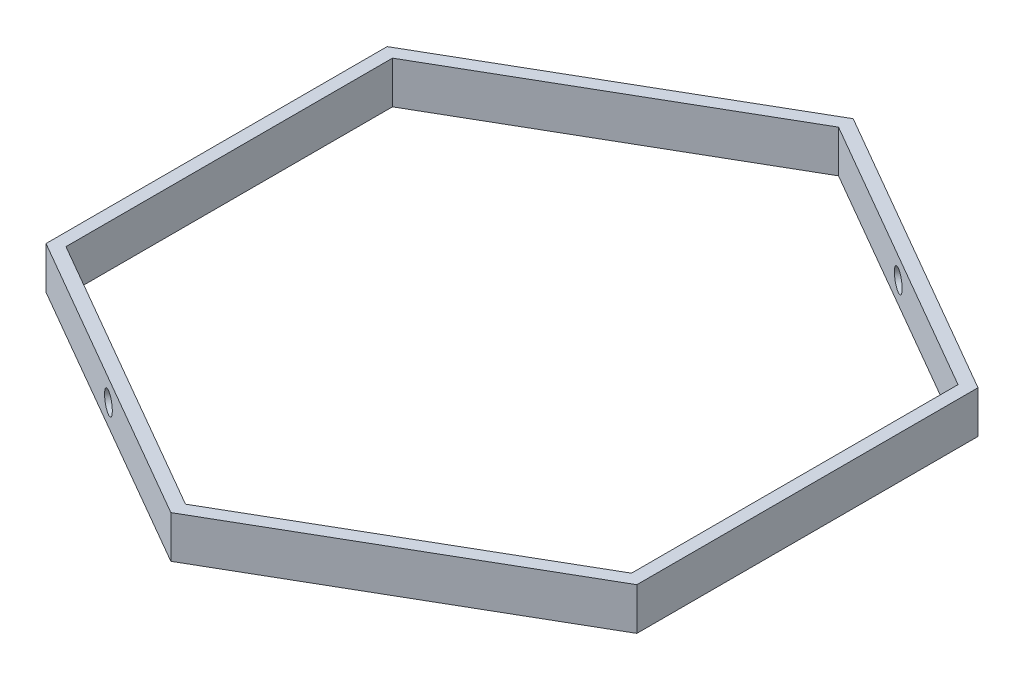
ISO-10303-21;
HEADER;
FILE_DESCRIPTION(('STEP AP214'),'2;1');
FILE_NAME('part.step','',(''),(''),'','','');
FILE_SCHEMA(('AUTOMOTIVE_DESIGN { 1 0 10303 214 1 1 1 1 }'));
ENDSEC;
DATA;
#1=APPLICATION_CONTEXT('core data for automotive mechanical design processes');
#2=APPLICATION_PROTOCOL_DEFINITION('international standard','automotive_design',2000,#1);
#3=PRODUCT_CONTEXT('',#1,'mechanical');
#4=PRODUCT('Part','Part','',(#3));
#5=PRODUCT_RELATED_PRODUCT_CATEGORY('part','',(#4));
#6=PRODUCT_DEFINITION_FORMATION('','',#4);
#7=PRODUCT_DEFINITION_CONTEXT('part definition',#1,'design');
#8=PRODUCT_DEFINITION('design','',#6,#7);
#9=PRODUCT_DEFINITION_SHAPE('','',#8);
#10=(LENGTH_UNIT() NAMED_UNIT(*) SI_UNIT(.MILLI.,.METRE.));
#11=(NAMED_UNIT(*) PLANE_ANGLE_UNIT() SI_UNIT($,.RADIAN.));
#12=(NAMED_UNIT(*) SI_UNIT($,.STERADIAN.) SOLID_ANGLE_UNIT());
#13=UNCERTAINTY_MEASURE_WITH_UNIT(LENGTH_MEASURE(1.E-05),#10,'distance_accuracy_value','');
#14=(GEOMETRIC_REPRESENTATION_CONTEXT(3) GLOBAL_UNCERTAINTY_ASSIGNED_CONTEXT((#13)) GLOBAL_UNIT_ASSIGNED_CONTEXT((#10,
#11,#12)) REPRESENTATION_CONTEXT('',''));
#15=CARTESIAN_POINT('',(0.,0.,0.));
#16=DIRECTION('',(0.,0.,1.));
#17=DIRECTION('',(1.,0.,0.));
#18=AXIS2_PLACEMENT_3D('',#15,#16,#17);
#19=CARTESIAN_POINT('',(0.,4.,0.));
#20=DIRECTION('',(0.,1.,0.));
#21=DIRECTION('',(0.,0.,1.));
#22=AXIS2_PLACEMENT_3D('',#19,#20,#21);
#23=PLANE('',#22);
#24=DIRECTION('',(-0.866025403784439,0.,-0.5));
#25=VECTOR('',#24,1.);
#26=CARTESIAN_POINT('',(28.,4.,-16.1658075373095));
#27=LINE('',#26,#25);
#28=CARTESIAN_POINT('',(28.,4.,-16.1658075373095));
#29=VERTEX_POINT('',#28);
#30=CARTESIAN_POINT('',(0.,4.,-32.331615074619));
#31=VERTEX_POINT('',#30);
#32=EDGE_CURVE('E182',#29,#31,#27,.T.);
#33=ORIENTED_EDGE('',*,*,#32,.T.);
#34=DIRECTION('',(-0.866025403784439,0.,0.5));
#35=VECTOR('',#34,1.);
#36=CARTESIAN_POINT('',(0.,4.,-32.331615074619));
#37=LINE('',#36,#35);
#38=CARTESIAN_POINT('',(-28.,4.,-16.1658075373095));
#39=VERTEX_POINT('',#38);
#40=EDGE_CURVE('E185',#31,#39,#37,.T.);
#41=ORIENTED_EDGE('',*,*,#40,.T.);
#42=DIRECTION('',(0.,0.,1.));
#43=VECTOR('',#42,1.);
#44=CARTESIAN_POINT('',(-28.,4.,-16.1658075373095));
#45=LINE('',#44,#43);
#46=CARTESIAN_POINT('',(-28.,4.,16.1658075373095));
#47=VERTEX_POINT('',#46);
#48=EDGE_CURVE('E188',#39,#47,#45,.T.);
#49=ORIENTED_EDGE('',*,*,#48,.T.);
#50=DIRECTION('',(0.866025403784439,0.,0.5));
#51=VECTOR('',#50,1.);
#52=CARTESIAN_POINT('',(-28.,4.,16.1658075373095));
#53=LINE('',#52,#51);
#54=CARTESIAN_POINT('',(0.,4.,32.3316150746191));
#55=VERTEX_POINT('',#54);
#56=EDGE_CURVE('E190',#47,#55,#53,.T.);
#57=ORIENTED_EDGE('',*,*,#56,.T.);
#58=DIRECTION('',(0.866025403784439,0.,-0.5));
#59=VECTOR('',#58,1.);
#60=CARTESIAN_POINT('',(0.,4.,32.3316150746191));
#61=LINE('',#60,#59);
#62=CARTESIAN_POINT('',(28.,4.,16.1658075373095));
#63=VERTEX_POINT('',#62);
#64=EDGE_CURVE('E192',#55,#63,#61,.T.);
#65=ORIENTED_EDGE('',*,*,#64,.T.);
#66=DIRECTION('',(0.,0.,-1.));
#67=VECTOR('',#66,1.);
#68=CARTESIAN_POINT('',(28.,4.,16.1658075373095));
#69=LINE('',#68,#67);
#70=EDGE_CURVE('E194',#63,#29,#69,.T.);
#71=ORIENTED_EDGE('',*,*,#70,.T.);
#72=EDGE_LOOP('',(#33,#41,#49,#57,#65,#71));
#73=FACE_BOUND('',#72,.T.);
#74=DIRECTION('',(-0.866025403784439,0.,-0.5));
#75=VECTOR('',#74,1.);
#76=CARTESIAN_POINT('',(26.8,4.,-15.472987214282));
#77=LINE('',#76,#75);
#78=CARTESIAN_POINT('',(26.8,4.,-15.472987214282));
#79=VERTEX_POINT('',#78);
#80=CARTESIAN_POINT('',(0.,4.,-30.9459744285639));
#81=VERTEX_POINT('',#80);
#82=EDGE_CURVE('E137',#79,#81,#77,.T.);
#83=ORIENTED_EDGE('',*,*,#82,.F.);
#84=DIRECTION('',(0.,0.,-1.));
#85=VECTOR('',#84,1.);
#86=CARTESIAN_POINT('',(26.8,4.,15.472987214282));
#87=LINE('',#86,#85);
#88=CARTESIAN_POINT('',(26.8,4.,15.472987214282));
#89=VERTEX_POINT('',#88);
#90=EDGE_CURVE('E129',#89,#79,#87,.T.);
#91=ORIENTED_EDGE('',*,*,#90,.F.);
#92=DIRECTION('',(0.866025403784438,0.,-0.5));
#93=VECTOR('',#92,1.);
#94=CARTESIAN_POINT('',(0.,4.,30.945974428564));
#95=LINE('',#94,#93);
#96=CARTESIAN_POINT('',(0.,4.,30.945974428564));
#97=VERTEX_POINT('',#96);
#98=EDGE_CURVE('E159',#97,#89,#95,.T.);
#99=ORIENTED_EDGE('',*,*,#98,.F.);
#100=DIRECTION('',(0.866025403784439,0.,0.5));
#101=VECTOR('',#100,1.);
#102=CARTESIAN_POINT('',(-26.8,4.,15.472987214282));
#103=LINE('',#102,#101);
#104=CARTESIAN_POINT('',(-26.8,4.,15.472987214282));
#105=VERTEX_POINT('',#104);
#106=EDGE_CURVE('E157',#105,#97,#103,.T.);
#107=ORIENTED_EDGE('',*,*,#106,.F.);
#108=DIRECTION('',(0.,0.,1.));
#109=VECTOR('',#108,1.);
#110=CARTESIAN_POINT('',(-26.8,4.,-15.472987214282));
#111=LINE('',#110,#109);
#112=CARTESIAN_POINT('',(-26.8,4.,-15.472987214282));
#113=VERTEX_POINT('',#112);
#114=EDGE_CURVE('E152',#113,#105,#111,.T.);
#115=ORIENTED_EDGE('',*,*,#114,.F.);
#116=DIRECTION('',(-0.866025403784439,0.,0.5));
#117=VECTOR('',#116,1.);
#118=CARTESIAN_POINT('',(0.,4.,-30.9459744285639));
#119=LINE('',#118,#117);
#120=EDGE_CURVE('E150',#81,#113,#119,.T.);
#121=ORIENTED_EDGE('',*,*,#120,.F.);
#122=EDGE_LOOP('',(#83,#91,#99,#107,#115,#121));
#123=FACE_BOUND('',#122,.T.);
#124=ADVANCED_FACE('F39',(#73,#123),#23,.T.);
#125=CARTESIAN_POINT('',(0.,0.,0.));
#126=DIRECTION('',(0.,1.,0.));
#127=DIRECTION('',(0.,0.,1.));
#128=AXIS2_PLACEMENT_3D('',#125,#126,#127);
#129=PLANE('',#128);
#130=DIRECTION('',(-0.866025403784439,0.,-0.5));
#131=VECTOR('',#130,1.);
#132=CARTESIAN_POINT('',(28.,0.,-16.1658075373095));
#133=LINE('',#132,#131);
#134=CARTESIAN_POINT('',(28.,0.,-16.1658075373095));
#135=VERTEX_POINT('',#134);
#136=CARTESIAN_POINT('',(0.,0.,-32.331615074619));
#137=VERTEX_POINT('',#136);
#138=EDGE_CURVE('E145',#135,#137,#133,.T.);
#139=ORIENTED_EDGE('',*,*,#138,.F.);
#140=DIRECTION('',(0.,0.,-1.));
#141=VECTOR('',#140,1.);
#142=CARTESIAN_POINT('',(28.,0.,16.1658075373095));
#143=LINE('',#142,#141);
#144=CARTESIAN_POINT('',(28.,0.,16.1658075373095));
#145=VERTEX_POINT('',#144);
#146=EDGE_CURVE('E186',#145,#135,#143,.T.);
#147=ORIENTED_EDGE('',*,*,#146,.F.);
#148=DIRECTION('',(0.866025403784439,0.,-0.5));
#149=VECTOR('',#148,1.);
#150=CARTESIAN_POINT('',(0.,0.,32.3316150746191));
#151=LINE('',#150,#149);
#152=CARTESIAN_POINT('',(0.,0.,32.3316150746191));
#153=VERTEX_POINT('',#152);
#154=EDGE_CURVE('E205',#153,#145,#151,.T.);
#155=ORIENTED_EDGE('',*,*,#154,.F.);
#156=DIRECTION('',(0.866025403784439,0.,0.5));
#157=VECTOR('',#156,1.);
#158=CARTESIAN_POINT('',(-28.,0.,16.1658075373095));
#159=LINE('',#158,#157);
#160=CARTESIAN_POINT('',(-28.,0.,16.1658075373095));
#161=VERTEX_POINT('',#160);
#162=EDGE_CURVE('E203',#161,#153,#159,.T.);
#163=ORIENTED_EDGE('',*,*,#162,.F.);
#164=DIRECTION('',(0.,0.,1.));
#165=VECTOR('',#164,1.);
#166=CARTESIAN_POINT('',(-28.,0.,-16.1658075373095));
#167=LINE('',#166,#165);
#168=CARTESIAN_POINT('',(-28.,0.,-16.1658075373095));
#169=VERTEX_POINT('',#168);
#170=EDGE_CURVE('E201',#169,#161,#167,.T.);
#171=ORIENTED_EDGE('',*,*,#170,.F.);
#172=DIRECTION('',(-0.866025403784439,0.,0.5));
#173=VECTOR('',#172,1.);
#174=CARTESIAN_POINT('',(0.,0.,-32.331615074619));
#175=LINE('',#174,#173);
#176=EDGE_CURVE('E199',#137,#169,#175,.T.);
#177=ORIENTED_EDGE('',*,*,#176,.F.);
#178=EDGE_LOOP('',(#139,#147,#155,#163,#171,#177));
#179=FACE_BOUND('',#178,.T.);
#180=DIRECTION('',(0.,0.,-1.));
#181=VECTOR('',#180,1.);
#182=CARTESIAN_POINT('',(26.8,0.,15.472987214282));
#183=LINE('',#182,#181);
#184=CARTESIAN_POINT('',(26.8,0.,15.472987214282));
#185=VERTEX_POINT('',#184);
#186=CARTESIAN_POINT('',(26.8,0.,-15.472987214282));
#187=VERTEX_POINT('',#186);
#188=EDGE_CURVE('E63',#185,#187,#183,.T.);
#189=ORIENTED_EDGE('',*,*,#188,.T.);
#190=DIRECTION('',(-0.866025403784439,0.,-0.5));
#191=VECTOR('',#190,1.);
#192=CARTESIAN_POINT('',(26.8,0.,-15.472987214282));
#193=LINE('',#192,#191);
#194=CARTESIAN_POINT('',(0.,0.,-30.9459744285639));
#195=VERTEX_POINT('',#194);
#196=EDGE_CURVE('E144',#187,#195,#193,.T.);
#197=ORIENTED_EDGE('',*,*,#196,.T.);
#198=DIRECTION('',(-0.866025403784439,0.,0.5));
#199=VECTOR('',#198,1.);
#200=CARTESIAN_POINT('',(0.,0.,-30.9459744285639));
#201=LINE('',#200,#199);
#202=CARTESIAN_POINT('',(-26.8,0.,-15.472987214282));
#203=VERTEX_POINT('',#202);
#204=EDGE_CURVE('E164',#195,#203,#201,.T.);
#205=ORIENTED_EDGE('',*,*,#204,.T.);
#206=DIRECTION('',(0.,0.,1.));
#207=VECTOR('',#206,1.);
#208=CARTESIAN_POINT('',(-26.8,0.,-15.472987214282));
#209=LINE('',#208,#207);
#210=CARTESIAN_POINT('',(-26.8,0.,15.472987214282));
#211=VERTEX_POINT('',#210);
#212=EDGE_CURVE('E167',#203,#211,#209,.T.);
#213=ORIENTED_EDGE('',*,*,#212,.T.);
#214=DIRECTION('',(0.866025403784439,0.,0.5));
#215=VECTOR('',#214,1.);
#216=CARTESIAN_POINT('',(-26.8,0.,15.472987214282));
#217=LINE('',#216,#215);
#218=CARTESIAN_POINT('',(0.,0.,30.945974428564));
#219=VERTEX_POINT('',#218);
#220=EDGE_CURVE('E170',#211,#219,#217,.T.);
#221=ORIENTED_EDGE('',*,*,#220,.T.);
#222=DIRECTION('',(0.866025403784438,0.,-0.5));
#223=VECTOR('',#222,1.);
#224=CARTESIAN_POINT('',(0.,0.,30.945974428564));
#225=LINE('',#224,#223);
#226=EDGE_CURVE('E138',#219,#185,#225,.T.);
#227=ORIENTED_EDGE('',*,*,#226,.T.);
#228=EDGE_LOOP('',(#189,#197,#205,#213,#221,#227));
#229=FACE_BOUND('',#228,.T.);
#230=ADVANCED_FACE('F230',(#179,#229),#129,.F.);
#231=CARTESIAN_POINT('',(28.,4.,-16.1658075373095));
#232=DIRECTION('',(-0.5,0.,0.866025403784439));
#233=DIRECTION('',(0.866025403784439,0.,0.5));
#234=AXIS2_PLACEMENT_3D('',#231,#232,#233);
#235=PLANE('',#234);
#236=CARTESIAN_POINT('',(14.,2.,-24.2487113059643));
#237=DIRECTION('',(-0.5,0.,0.866025403784439));
#238=DIRECTION('',(0.866025403784439,0.,0.5));
#239=AXIS2_PLACEMENT_3D('',#236,#237,#238);
#240=CIRCLE('',#239,1.);
#241=CARTESIAN_POINT('',(14.8660254037845,2.,-23.7487113059643));
#242=VERTEX_POINT('',#241);
#243=EDGE_CURVE('E162',#242,#242,#240,.T.);
#244=ORIENTED_EDGE('',*,*,#243,.T.);
#245=EDGE_LOOP('',(#244));
#246=FACE_BOUND('',#245,.T.);
#247=ORIENTED_EDGE('',*,*,#138,.T.);
#248=DIRECTION('',(0.,-1.,0.));
#249=VECTOR('',#248,1.);
#250=CARTESIAN_POINT('',(0.,4.,-32.331615074619));
#251=LINE('',#250,#249);
#252=EDGE_CURVE('E11',#31,#137,#251,.T.);
#253=ORIENTED_EDGE('',*,*,#252,.F.);
#254=ORIENTED_EDGE('',*,*,#32,.F.);
#255=DIRECTION('',(0.,-1.,0.));
#256=VECTOR('',#255,1.);
#257=CARTESIAN_POINT('',(28.,4.,-16.1658075373095));
#258=LINE('',#257,#256);
#259=EDGE_CURVE('E196',#29,#135,#258,.T.);
#260=ORIENTED_EDGE('',*,*,#259,.T.);
#261=EDGE_LOOP('',(#247,#253,#254,#260));
#262=FACE_BOUND('',#261,.T.);
#263=ADVANCED_FACE('F41',(#246,#262),#235,.F.);
#264=CARTESIAN_POINT('',(0.,4.,-32.331615074619));
#265=DIRECTION('',(0.5,0.,0.866025403784439));
#266=DIRECTION('',(0.866025403784439,0.,-0.5));
#267=AXIS2_PLACEMENT_3D('',#264,#265,#266);
#268=PLANE('',#267);
#269=ORIENTED_EDGE('',*,*,#176,.T.);
#270=DIRECTION('',(0.,-1.,0.));
#271=VECTOR('',#270,1.);
#272=CARTESIAN_POINT('',(-28.,4.,-16.1658075373095));
#273=LINE('',#272,#271);
#274=EDGE_CURVE('E48',#39,#169,#273,.T.);
#275=ORIENTED_EDGE('',*,*,#274,.F.);
#276=ORIENTED_EDGE('',*,*,#40,.F.);
#277=ORIENTED_EDGE('',*,*,#252,.T.);
#278=EDGE_LOOP('',(#269,#275,#276,#277));
#279=FACE_BOUND('',#278,.T.);
#280=ADVANCED_FACE('F247',(#279),#268,.F.);
#281=CARTESIAN_POINT('',(-28.,4.,-16.1658075373095));
#282=DIRECTION('',(1.,0.,0.));
#283=DIRECTION('',(0.,0.,-1.));
#284=AXIS2_PLACEMENT_3D('',#281,#282,#283);
#285=PLANE('',#284);
#286=ORIENTED_EDGE('',*,*,#170,.T.);
#287=DIRECTION('',(0.,-1.,0.));
#288=VECTOR('',#287,1.);
#289=CARTESIAN_POINT('',(-28.,4.,16.1658075373095));
#290=LINE('',#289,#288);
#291=EDGE_CURVE('E216',#47,#161,#290,.T.);
#292=ORIENTED_EDGE('',*,*,#291,.F.);
#293=ORIENTED_EDGE('',*,*,#48,.F.);
#294=ORIENTED_EDGE('',*,*,#274,.T.);
#295=EDGE_LOOP('',(#286,#292,#293,#294));
#296=FACE_BOUND('',#295,.T.);
#297=ADVANCED_FACE('F224',(#296),#285,.F.);
#298=CARTESIAN_POINT('',(-28.,4.,16.1658075373095));
#299=DIRECTION('',(0.5,0.,-0.866025403784439));
#300=DIRECTION('',(-0.866025403784439,0.,-0.5));
#301=AXIS2_PLACEMENT_3D('',#298,#299,#300);
#302=PLANE('',#301);
#303=CARTESIAN_POINT('',(-14.,2.,24.2487113059643));
#304=DIRECTION('',(-0.5,0.,0.866025403784439));
#305=DIRECTION('',(0.866025403784439,0.,0.5));
#306=AXIS2_PLACEMENT_3D('',#303,#304,#305);
#307=CIRCLE('',#306,1.);
#308=CARTESIAN_POINT('',(-13.1339745962156,2.,24.7487113059643));
#309=VERTEX_POINT('',#308);
#310=EDGE_CURVE('E297',#309,#309,#307,.T.);
#311=ORIENTED_EDGE('',*,*,#310,.F.);
#312=EDGE_LOOP('',(#311));
#313=FACE_BOUND('',#312,.T.);
#314=ORIENTED_EDGE('',*,*,#162,.T.);
#315=DIRECTION('',(0.,-1.,0.));
#316=VECTOR('',#315,1.);
#317=CARTESIAN_POINT('',(0.,4.,32.3316150746191));
#318=LINE('',#317,#316);
#319=EDGE_CURVE('E213',#55,#153,#318,.T.);
#320=ORIENTED_EDGE('',*,*,#319,.F.);
#321=ORIENTED_EDGE('',*,*,#56,.F.);
#322=ORIENTED_EDGE('',*,*,#291,.T.);
#323=EDGE_LOOP('',(#314,#320,#321,#322));
#324=FACE_BOUND('',#323,.T.);
#325=ADVANCED_FACE('F236',(#313,#324),#302,.F.);
#326=CARTESIAN_POINT('',(0.,4.,32.3316150746191));
#327=DIRECTION('',(-0.5,0.,-0.866025403784438));
#328=DIRECTION('',(-0.866025403784439,0.,0.5));
#329=AXIS2_PLACEMENT_3D('',#326,#327,#328);
#330=PLANE('',#329);
#331=ORIENTED_EDGE('',*,*,#154,.T.);
#332=DIRECTION('',(0.,-1.,0.));
#333=VECTOR('',#332,1.);
#334=CARTESIAN_POINT('',(28.,4.,16.1658075373095));
#335=LINE('',#334,#333);
#336=EDGE_CURVE('E210',#63,#145,#335,.T.);
#337=ORIENTED_EDGE('',*,*,#336,.F.);
#338=ORIENTED_EDGE('',*,*,#64,.F.);
#339=ORIENTED_EDGE('',*,*,#319,.T.);
#340=EDGE_LOOP('',(#331,#337,#338,#339));
#341=FACE_BOUND('',#340,.T.);
#342=ADVANCED_FACE('F240',(#341),#330,.F.);
#343=CARTESIAN_POINT('',(28.,4.,16.1658075373095));
#344=DIRECTION('',(-1.,0.,0.));
#345=DIRECTION('',(0.,0.,1.));
#346=AXIS2_PLACEMENT_3D('',#343,#344,#345);
#347=PLANE('',#346);
#348=ORIENTED_EDGE('',*,*,#146,.T.);
#349=ORIENTED_EDGE('',*,*,#259,.F.);
#350=ORIENTED_EDGE('',*,*,#70,.F.);
#351=ORIENTED_EDGE('',*,*,#336,.T.);
#352=EDGE_LOOP('',(#348,#349,#350,#351));
#353=FACE_BOUND('',#352,.T.);
#354=ADVANCED_FACE('F250',(#353),#347,.F.);
#355=CARTESIAN_POINT('',(26.8,4.,15.472987214282));
#356=DIRECTION('',(-1.,0.,0.));
#357=DIRECTION('',(0.,0.,1.));
#358=AXIS2_PLACEMENT_3D('',#355,#356,#357);
#359=PLANE('',#358);
#360=ORIENTED_EDGE('',*,*,#188,.F.);
#361=DIRECTION('',(0.,-1.,0.));
#362=VECTOR('',#361,1.);
#363=CARTESIAN_POINT('',(26.8,4.,15.472987214282));
#364=LINE('',#363,#362);
#365=EDGE_CURVE('E133',#89,#185,#364,.T.);
#366=ORIENTED_EDGE('',*,*,#365,.F.);
#367=ORIENTED_EDGE('',*,*,#90,.T.);
#368=DIRECTION('',(0.,-1.,0.));
#369=VECTOR('',#368,1.);
#370=CARTESIAN_POINT('',(26.8,4.,-15.472987214282));
#371=LINE('',#370,#369);
#372=EDGE_CURVE('E132',#79,#187,#371,.T.);
#373=ORIENTED_EDGE('',*,*,#372,.T.);
#374=EDGE_LOOP('',(#360,#366,#367,#373));
#375=FACE_BOUND('',#374,.T.);
#376=ADVANCED_FACE('F131',(#375),#359,.T.);
#377=CARTESIAN_POINT('',(26.8,4.,-15.472987214282));
#378=DIRECTION('',(-0.5,0.,0.866025403784439));
#379=DIRECTION('',(0.866025403784439,0.,0.5));
#380=AXIS2_PLACEMENT_3D('',#377,#378,#379);
#381=PLANE('',#380);
#382=CARTESIAN_POINT('',(13.4,2.,-23.2094808214229));
#383=DIRECTION('',(-0.5,0.,0.866025403784439));
#384=DIRECTION('',(0.866025403784439,0.,0.5));
#385=AXIS2_PLACEMENT_3D('',#382,#383,#384);
#386=CIRCLE('',#385,1.);
#387=CARTESIAN_POINT('',(14.2660254037845,2.,-22.7094808214229));
#388=VERTEX_POINT('',#387);
#389=EDGE_CURVE('E300',#388,#388,#386,.T.);
#390=ORIENTED_EDGE('',*,*,#389,.F.);
#391=EDGE_LOOP('',(#390));
#392=FACE_BOUND('',#391,.T.);
#393=ORIENTED_EDGE('',*,*,#196,.F.);
#394=ORIENTED_EDGE('',*,*,#372,.F.);
#395=ORIENTED_EDGE('',*,*,#82,.T.);
#396=DIRECTION('',(0.,-1.,0.));
#397=VECTOR('',#396,1.);
#398=CARTESIAN_POINT('',(0.,4.,-30.9459744285639));
#399=LINE('',#398,#397);
#400=EDGE_CURVE('E146',#81,#195,#399,.T.);
#401=ORIENTED_EDGE('',*,*,#400,.T.);
#402=EDGE_LOOP('',(#393,#394,#395,#401));
#403=FACE_BOUND('',#402,.T.);
#404=ADVANCED_FACE('F141',(#392,#403),#381,.T.);
#405=CARTESIAN_POINT('',(0.,4.,-30.9459744285639));
#406=DIRECTION('',(0.5,0.,0.866025403784439));
#407=DIRECTION('',(0.866025403784439,0.,-0.5));
#408=AXIS2_PLACEMENT_3D('',#405,#406,#407);
#409=PLANE('',#408);
#410=ORIENTED_EDGE('',*,*,#204,.F.);
#411=ORIENTED_EDGE('',*,*,#400,.F.);
#412=ORIENTED_EDGE('',*,*,#120,.T.);
#413=DIRECTION('',(0.,-1.,0.));
#414=VECTOR('',#413,1.);
#415=CARTESIAN_POINT('',(-26.8,4.,-15.472987214282));
#416=LINE('',#415,#414);
#417=EDGE_CURVE('E179',#113,#203,#416,.T.);
#418=ORIENTED_EDGE('',*,*,#417,.T.);
#419=EDGE_LOOP('',(#410,#411,#412,#418));
#420=FACE_BOUND('',#419,.T.);
#421=ADVANCED_FACE('F268',(#420),#409,.T.);
#422=CARTESIAN_POINT('',(-26.8,4.,-15.472987214282));
#423=DIRECTION('',(1.,0.,0.));
#424=DIRECTION('',(0.,0.,-1.));
#425=AXIS2_PLACEMENT_3D('',#422,#423,#424);
#426=PLANE('',#425);
#427=ORIENTED_EDGE('',*,*,#212,.F.);
#428=ORIENTED_EDGE('',*,*,#417,.F.);
#429=ORIENTED_EDGE('',*,*,#114,.T.);
#430=DIRECTION('',(0.,-1.,0.));
#431=VECTOR('',#430,1.);
#432=CARTESIAN_POINT('',(-26.8,4.,15.472987214282));
#433=LINE('',#432,#431);
#434=EDGE_CURVE('E177',#105,#211,#433,.T.);
#435=ORIENTED_EDGE('',*,*,#434,.T.);
#436=EDGE_LOOP('',(#427,#428,#429,#435));
#437=FACE_BOUND('',#436,.T.);
#438=ADVANCED_FACE('F272',(#437),#426,.T.);
#439=CARTESIAN_POINT('',(-26.8,4.,15.472987214282));
#440=DIRECTION('',(0.5,0.,-0.866025403784439));
#441=DIRECTION('',(-0.866025403784439,0.,-0.5));
#442=AXIS2_PLACEMENT_3D('',#439,#440,#441);
#443=PLANE('',#442);
#444=CARTESIAN_POINT('',(-13.4,2.,23.209480821423));
#445=DIRECTION('',(0.5,0.,-0.866025403784439));
#446=DIRECTION('',(-0.866025403784439,0.,-0.5));
#447=AXIS2_PLACEMENT_3D('',#444,#445,#446);
#448=CIRCLE('',#447,1.);
#449=CARTESIAN_POINT('',(-14.2660254037844,2.,22.709480821423));
#450=VERTEX_POINT('',#449);
#451=EDGE_CURVE('E43',#450,#450,#448,.T.);
#452=ORIENTED_EDGE('',*,*,#451,.F.);
#453=EDGE_LOOP('',(#452));
#454=FACE_BOUND('',#453,.T.);
#455=ORIENTED_EDGE('',*,*,#220,.F.);
#456=ORIENTED_EDGE('',*,*,#434,.F.);
#457=ORIENTED_EDGE('',*,*,#106,.T.);
#458=DIRECTION('',(0.,-1.,0.));
#459=VECTOR('',#458,1.);
#460=CARTESIAN_POINT('',(0.,4.,30.945974428564));
#461=LINE('',#460,#459);
#462=EDGE_CURVE('E55',#97,#219,#461,.T.);
#463=ORIENTED_EDGE('',*,*,#462,.T.);
#464=EDGE_LOOP('',(#455,#456,#457,#463));
#465=FACE_BOUND('',#464,.T.);
#466=ADVANCED_FACE('F276',(#454,#465),#443,.T.);
#467=CARTESIAN_POINT('',(0.,4.,30.945974428564));
#468=DIRECTION('',(-0.5,0.,-0.866025403784438));
#469=DIRECTION('',(-0.866025403784438,0.,0.5));
#470=AXIS2_PLACEMENT_3D('',#467,#468,#469);
#471=PLANE('',#470);
#472=ORIENTED_EDGE('',*,*,#226,.F.);
#473=ORIENTED_EDGE('',*,*,#462,.F.);
#474=ORIENTED_EDGE('',*,*,#98,.T.);
#475=ORIENTED_EDGE('',*,*,#365,.T.);
#476=EDGE_LOOP('',(#472,#473,#474,#475));
#477=FACE_BOUND('',#476,.T.);
#478=ADVANCED_FACE('F280',(#477),#471,.T.);
#479=CARTESIAN_POINT('',(21.,2.,-36.3730669589464));
#480=DIRECTION('',(-0.5,0.,0.866025403784439));
#481=DIRECTION('',(0.866025403784439,0.,0.5));
#482=AXIS2_PLACEMENT_3D('',#479,#480,#481);
#483=CYLINDRICAL_SURFACE('',#482,1.);
#484=ORIENTED_EDGE('',*,*,#451,.T.);
#485=EDGE_LOOP('',(#484));
#486=FACE_BOUND('',#485,.T.);
#487=ORIENTED_EDGE('',*,*,#310,.T.);
#488=EDGE_LOOP('',(#487));
#489=FACE_BOUND('',#488,.T.);
#490=ADVANCED_FACE('F284',(#486,#489),#483,.F.);
#491=ORIENTED_EDGE('',*,*,#389,.T.);
#492=EDGE_LOOP('',(#491));
#493=FACE_BOUND('',#492,.T.);
#494=ORIENTED_EDGE('',*,*,#243,.F.);
#495=EDGE_LOOP('',(#494));
#496=FACE_BOUND('',#495,.T.);
#497=ADVANCED_FACE('F286',(#493,#496),#483,.F.);
#498=CLOSED_SHELL('',(#124,#230,#263,#280,#297,#325,#342,#354,#376,#404,#421,#438,#466,#478,
#490,#497));
#499=MANIFOLD_SOLID_BREP('B2',#498);
#500=ADVANCED_BREP_SHAPE_REPRESENTATION('',(#18,#499),#14);
#501=SHAPE_DEFINITION_REPRESENTATION(#9,#500);
ENDSEC;
END-ISO-10303-21;
